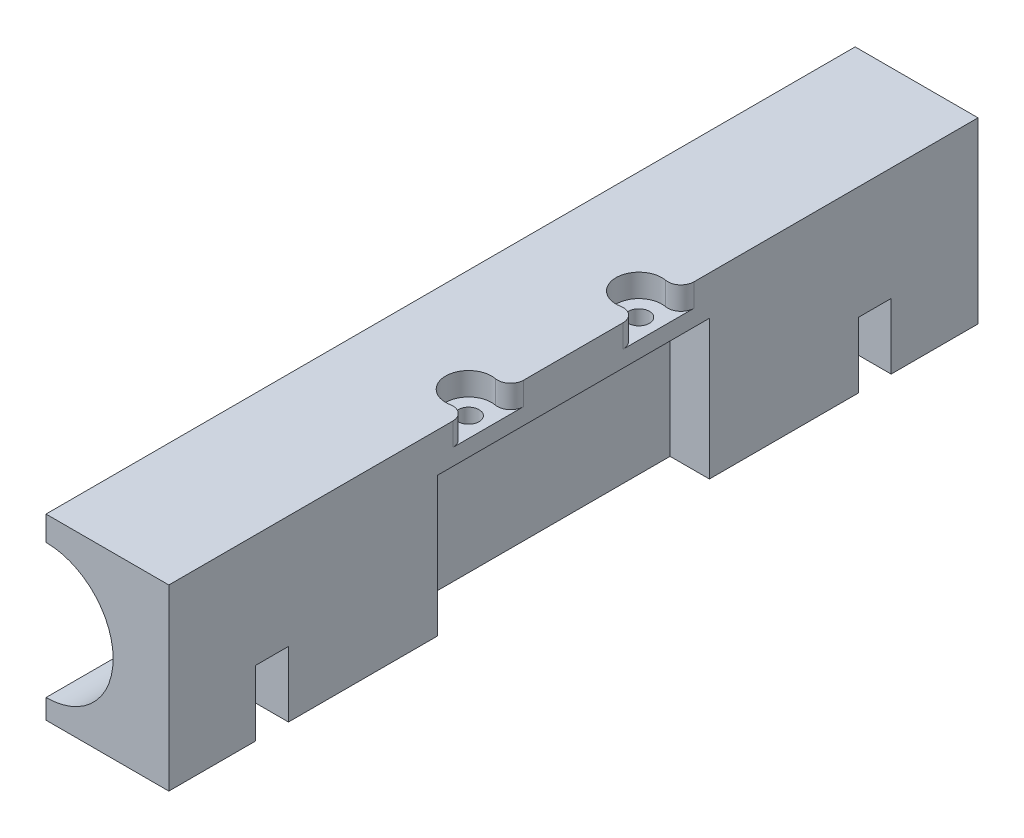
ISO-10303-21;
HEADER;
FILE_DESCRIPTION(('STEP AP214'),'2;1');
FILE_NAME('part.step','',(''),(''),'','','');
FILE_SCHEMA(('AUTOMOTIVE_DESIGN { 1 0 10303 214 1 1 1 1 }'));
ENDSEC;
DATA;
#1=APPLICATION_CONTEXT('core data for automotive mechanical design processes');
#2=APPLICATION_PROTOCOL_DEFINITION('international standard','automotive_design',2000,#1);
#3=PRODUCT_CONTEXT('',#1,'mechanical');
#4=PRODUCT('Part','Part','',(#3));
#5=PRODUCT_RELATED_PRODUCT_CATEGORY('part','',(#4));
#6=PRODUCT_DEFINITION_FORMATION('','',#4);
#7=PRODUCT_DEFINITION_CONTEXT('part definition',#1,'design');
#8=PRODUCT_DEFINITION('design','',#6,#7);
#9=PRODUCT_DEFINITION_SHAPE('','',#8);
#10=(LENGTH_UNIT() NAMED_UNIT(*) SI_UNIT(.MILLI.,.METRE.));
#11=(NAMED_UNIT(*) PLANE_ANGLE_UNIT() SI_UNIT($,.RADIAN.));
#12=(NAMED_UNIT(*) SI_UNIT($,.STERADIAN.) SOLID_ANGLE_UNIT());
#13=UNCERTAINTY_MEASURE_WITH_UNIT(LENGTH_MEASURE(1.E-05),#10,'distance_accuracy_value','');
#14=(GEOMETRIC_REPRESENTATION_CONTEXT(3) GLOBAL_UNCERTAINTY_ASSIGNED_CONTEXT((#13)) GLOBAL_UNIT_ASSIGNED_CONTEXT((#10,
#11,#12)) REPRESENTATION_CONTEXT('',''));
#15=CARTESIAN_POINT('',(0.,0.,0.));
#16=DIRECTION('',(0.,0.,1.));
#17=DIRECTION('',(1.,0.,0.));
#18=AXIS2_PLACEMENT_3D('',#15,#16,#17);
#19=CARTESIAN_POINT('',(-15.75,0.,47.75));
#20=DIRECTION('',(1.,0.,0.));
#21=DIRECTION('',(0.,0.,-1.));
#22=AXIS2_PLACEMENT_3D('',#19,#20,#21);
#23=PLANE('',#22);
#24=DIRECTION('',(0.,0.,-1.));
#25=VECTOR('',#24,1.);
#26=CARTESIAN_POINT('',(-15.75,-18.25,47.75));
#27=LINE('',#26,#25);
#28=CARTESIAN_POINT('',(-15.75,-18.25,43.49));
#29=VERTEX_POINT('',#28);
#30=CARTESIAN_POINT('',(-15.75,-18.25,-43.49));
#31=VERTEX_POINT('',#30);
#32=EDGE_CURVE('E254',#29,#31,#27,.T.);
#33=ORIENTED_EDGE('',*,*,#32,.T.);
#34=DIRECTION('',(0.,-1.,0.));
#35=VECTOR('',#34,1.);
#36=CARTESIAN_POINT('',(-15.75,-21.25,-43.49));
#37=LINE('',#36,#35);
#38=CARTESIAN_POINT('',(-15.75,-21.25,-43.49));
#39=VERTEX_POINT('',#38);
#40=EDGE_CURVE('E238',#31,#39,#37,.T.);
#41=ORIENTED_EDGE('',*,*,#40,.T.);
#42=DIRECTION('',(0.,0.,-1.));
#43=VECTOR('',#42,1.);
#44=CARTESIAN_POINT('',(-15.75,-21.25,47.75));
#45=LINE('',#44,#43);
#46=CARTESIAN_POINT('',(-15.75,-21.25,43.49));
#47=VERTEX_POINT('',#46);
#48=EDGE_CURVE('E252',#47,#39,#45,.T.);
#49=ORIENTED_EDGE('',*,*,#48,.F.);
#50=DIRECTION('',(0.,1.,0.));
#51=VECTOR('',#50,1.);
#52=CARTESIAN_POINT('',(-15.75,-21.25,43.49));
#53=LINE('',#52,#51);
#54=EDGE_CURVE('E74',#47,#29,#53,.T.);
#55=ORIENTED_EDGE('',*,*,#54,.T.);
#56=EDGE_LOOP('',(#33,#41,#49,#55));
#57=FACE_BOUND('',#56,.T.);
#58=ADVANCED_FACE('F50',(#57),#23,.F.);
#59=CARTESIAN_POINT('',(-15.75,-18.25,61.75));
#60=VERTEX_POINT('',#59);
#61=CARTESIAN_POINT('',(-15.7500000000001,-18.25,48.49));
#62=VERTEX_POINT('',#61);
#63=EDGE_CURVE('E276',#60,#62,#27,.T.);
#64=ORIENTED_EDGE('',*,*,#63,.T.);
#65=DIRECTION('',(0.,-1.,0.));
#66=VECTOR('',#65,1.);
#67=CARTESIAN_POINT('',(-15.7500000000001,-21.25,48.49));
#68=LINE('',#67,#66);
#69=CARTESIAN_POINT('',(-15.7500000000001,-21.25,48.49));
#70=VERTEX_POINT('',#69);
#71=EDGE_CURVE('E414',#62,#70,#68,.T.);
#72=ORIENTED_EDGE('',*,*,#71,.T.);
#73=CARTESIAN_POINT('',(-15.75,-21.25,61.75));
#74=VERTEX_POINT('',#73);
#75=EDGE_CURVE('E262',#74,#70,#45,.T.);
#76=ORIENTED_EDGE('',*,*,#75,.F.);
#77=DIRECTION('',(0.,-1.,0.));
#78=VECTOR('',#77,1.);
#79=CARTESIAN_POINT('',(-15.75,-18.25,61.75));
#80=LINE('',#79,#78);
#81=EDGE_CURVE('E475',#60,#74,#80,.T.);
#82=ORIENTED_EDGE('',*,*,#81,.F.);
#83=EDGE_LOOP('',(#64,#72,#76,#82));
#84=FACE_BOUND('',#83,.T.);
#85=ADVANCED_FACE('F559',(#84),#23,.F.);
#86=CARTESIAN_POINT('',(0.,-21.25,47.75));
#87=DIRECTION('',(0.,1.,0.));
#88=DIRECTION('',(0.,0.,1.));
#89=AXIS2_PLACEMENT_3D('',#86,#87,#88);
#90=PLANE('',#89);
#91=ORIENTED_EDGE('',*,*,#48,.T.);
#92=DIRECTION('',(1.,0.,0.));
#93=VECTOR('',#92,1.);
#94=CARTESIAN_POINT('',(-15.75,-21.25,-43.49));
#95=LINE('',#94,#93);
#96=CARTESIAN_POINT('',(3.00000000000002,-21.25,-43.49));
#97=VERTEX_POINT('',#96);
#98=EDGE_CURVE('E235',#39,#97,#95,.T.);
#99=ORIENTED_EDGE('',*,*,#98,.T.);
#100=DIRECTION('',(0.,0.,-1.));
#101=VECTOR('',#100,1.);
#102=CARTESIAN_POINT('',(3.,-21.25,47.75));
#103=LINE('',#102,#101);
#104=CARTESIAN_POINT('',(2.99999999999999,-21.25,-20.75));
#105=VERTEX_POINT('',#104);
#106=EDGE_CURVE('E532',#105,#97,#103,.T.);
#107=ORIENTED_EDGE('',*,*,#106,.F.);
#108=DIRECTION('',(-1.,0.,0.));
#109=VECTOR('',#108,1.);
#110=CARTESIAN_POINT('',(2.99999999999999,-21.25,-20.75));
#111=LINE('',#110,#109);
#112=CARTESIAN_POINT('',(-3.00000000000001,-21.25,-20.75));
#113=VERTEX_POINT('',#112);
#114=EDGE_CURVE('E505',#105,#113,#111,.T.);
#115=ORIENTED_EDGE('',*,*,#114,.T.);
#116=DIRECTION('',(0.,0.,1.));
#117=VECTOR('',#116,1.);
#118=CARTESIAN_POINT('',(-3.00000000000001,-21.25,-20.75));
#119=LINE('',#118,#117);
#120=CARTESIAN_POINT('',(-3.00000000000001,-21.25,20.75));
#121=VERTEX_POINT('',#120);
#122=EDGE_CURVE('E509',#113,#121,#119,.T.);
#123=ORIENTED_EDGE('',*,*,#122,.T.);
#124=DIRECTION('',(1.,0.,0.));
#125=VECTOR('',#124,1.);
#126=CARTESIAN_POINT('',(-3.00000000000001,-21.25,20.75));
#127=LINE('',#126,#125);
#128=CARTESIAN_POINT('',(2.99999999999999,-21.25,20.75));
#129=VERTEX_POINT('',#128);
#130=EDGE_CURVE('E513',#121,#129,#127,.T.);
#131=ORIENTED_EDGE('',*,*,#130,.T.);
#132=CARTESIAN_POINT('',(2.99999999999998,-21.25,43.49));
#133=VERTEX_POINT('',#132);
#134=EDGE_CURVE('E533',#133,#129,#103,.T.);
#135=ORIENTED_EDGE('',*,*,#134,.F.);
#136=DIRECTION('',(1.,0.,0.));
#137=VECTOR('',#136,1.);
#138=CARTESIAN_POINT('',(-15.75,-21.25,43.49));
#139=LINE('',#138,#137);
#140=EDGE_CURVE('E260',#47,#133,#139,.T.);
#141=ORIENTED_EDGE('',*,*,#140,.F.);
#142=EDGE_LOOP('',(#91,#99,#107,#115,#123,#131,#135,#141));
#143=FACE_BOUND('',#142,.T.);
#144=ADVANCED_FACE('F258',(#143),#90,.F.);
#145=ORIENTED_EDGE('',*,*,#75,.T.);
#146=DIRECTION('',(1.,0.,0.));
#147=VECTOR('',#146,1.);
#148=CARTESIAN_POINT('',(-15.7500000000001,-21.25,48.49));
#149=LINE('',#148,#147);
#150=CARTESIAN_POINT('',(2.99999999999998,-21.25,48.49));
#151=VERTEX_POINT('',#150);
#152=EDGE_CURVE('E417',#70,#151,#149,.T.);
#153=ORIENTED_EDGE('',*,*,#152,.T.);
#154=CARTESIAN_POINT('',(3.,-21.25,61.75));
#155=VERTEX_POINT('',#154);
#156=EDGE_CURVE('E272',#155,#151,#103,.T.);
#157=ORIENTED_EDGE('',*,*,#156,.F.);
#158=DIRECTION('',(1.,0.,0.));
#159=VECTOR('',#158,1.);
#160=CARTESIAN_POINT('',(-15.75,-21.25,61.75));
#161=LINE('',#160,#159);
#162=EDGE_CURVE('E479',#74,#155,#161,.T.);
#163=ORIENTED_EDGE('',*,*,#162,.F.);
#164=EDGE_LOOP('',(#145,#153,#157,#163));
#165=FACE_BOUND('',#164,.T.);
#166=ADVANCED_FACE('F552',(#165),#90,.F.);
#167=CARTESIAN_POINT('',(0.,3.,-13.));
#168=DIRECTION('',(0.,-1.,0.));
#169=DIRECTION('',(0.,0.,-1.));
#170=AXIS2_PLACEMENT_3D('',#167,#168,#169);
#171=CYLINDRICAL_SURFACE('',#170,1.6);
#172=CARTESIAN_POINT('',(0.,0.,-13.));
#173=DIRECTION('',(0.,1.,0.));
#174=DIRECTION('',(0.,0.,1.));
#175=AXIS2_PLACEMENT_3D('',#172,#173,#174);
#176=CIRCLE('',#175,1.6);
#177=CARTESIAN_POINT('',(0.,0.,-11.4));
#178=VERTEX_POINT('',#177);
#179=EDGE_CURVE('E298',#178,#178,#176,.T.);
#180=ORIENTED_EDGE('',*,*,#179,.F.);
#181=EDGE_LOOP('',(#180));
#182=FACE_BOUND('',#181,.T.);
#183=CARTESIAN_POINT('',(0.,2.5,-13.));
#184=DIRECTION('',(0.,1.,0.));
#185=DIRECTION('',(0.,0.,1.));
#186=AXIS2_PLACEMENT_3D('',#183,#184,#185);
#187=CIRCLE('',#186,1.6);
#188=CARTESIAN_POINT('',(0.,2.5,-11.4));
#189=VERTEX_POINT('',#188);
#190=EDGE_CURVE('E331',#189,#189,#187,.T.);
#191=ORIENTED_EDGE('',*,*,#190,.T.);
#192=EDGE_LOOP('',(#191));
#193=FACE_BOUND('',#192,.T.);
#194=ADVANCED_FACE('F760',(#182,#193),#171,.F.);
#195=CARTESIAN_POINT('',(0.,3.,13.));
#196=DIRECTION('',(0.,-1.,0.));
#197=DIRECTION('',(0.,0.,-1.));
#198=AXIS2_PLACEMENT_3D('',#195,#196,#197);
#199=CYLINDRICAL_SURFACE('',#198,1.6);
#200=CARTESIAN_POINT('',(0.,0.,13.));
#201=DIRECTION('',(0.,1.,0.));
#202=DIRECTION('',(0.,0.,1.));
#203=AXIS2_PLACEMENT_3D('',#200,#201,#202);
#204=CIRCLE('',#203,1.6);
#205=CARTESIAN_POINT('',(0.,0.,14.6));
#206=VERTEX_POINT('',#205);
#207=EDGE_CURVE('E289',#206,#206,#204,.T.);
#208=ORIENTED_EDGE('',*,*,#207,.F.);
#209=EDGE_LOOP('',(#208));
#210=FACE_BOUND('',#209,.T.);
#211=CARTESIAN_POINT('',(0.,2.5,13.));
#212=DIRECTION('',(0.,1.,0.));
#213=DIRECTION('',(0.,0.,1.));
#214=AXIS2_PLACEMENT_3D('',#211,#212,#213);
#215=CIRCLE('',#214,1.6);
#216=CARTESIAN_POINT('',(0.,2.5,14.6));
#217=VERTEX_POINT('',#216);
#218=EDGE_CURVE('E325',#217,#217,#215,.T.);
#219=ORIENTED_EDGE('',*,*,#218,.T.);
#220=EDGE_LOOP('',(#219));
#221=FACE_BOUND('',#220,.T.);
#222=ADVANCED_FACE('F757',(#210,#221),#199,.F.);
#223=CARTESIAN_POINT('',(0.,0.,0.));
#224=DIRECTION('',(0.,-1.,0.));
#225=DIRECTION('',(0.,0.,-1.));
#226=AXIS2_PLACEMENT_3D('',#223,#224,#225);
#227=PLANE('',#226);
#228=ORIENTED_EDGE('',*,*,#179,.T.);
#229=EDGE_LOOP('',(#228));
#230=FACE_BOUND('',#229,.T.);
#231=DIRECTION('',(0.,0.,-1.));
#232=VECTOR('',#231,1.);
#233=CARTESIAN_POINT('',(2.99999999999999,0.,20.75));
#234=LINE('',#233,#232);
#235=CARTESIAN_POINT('',(2.99999999999999,0.,20.75));
#236=VERTEX_POINT('',#235);
#237=CARTESIAN_POINT('',(2.99999999999999,0.,-20.75));
#238=VERTEX_POINT('',#237);
#239=EDGE_CURVE('E302',#236,#238,#234,.T.);
#240=ORIENTED_EDGE('',*,*,#239,.F.);
#241=DIRECTION('',(1.,0.,0.));
#242=VECTOR('',#241,1.);
#243=CARTESIAN_POINT('',(-3.00000000000001,0.,20.75));
#244=LINE('',#243,#242);
#245=CARTESIAN_POINT('',(-3.00000000000001,0.,20.75));
#246=VERTEX_POINT('',#245);
#247=EDGE_CURVE('E313',#246,#236,#244,.T.);
#248=ORIENTED_EDGE('',*,*,#247,.F.);
#249=DIRECTION('',(0.,0.,1.));
#250=VECTOR('',#249,1.);
#251=CARTESIAN_POINT('',(-3.00000000000001,0.,20.75));
#252=LINE('',#251,#250);
#253=CARTESIAN_POINT('',(-3.00000000000001,0.,-20.75));
#254=VERTEX_POINT('',#253);
#255=EDGE_CURVE('E309',#254,#246,#252,.T.);
#256=ORIENTED_EDGE('',*,*,#255,.F.);
#257=DIRECTION('',(-1.,0.,0.));
#258=VECTOR('',#257,1.);
#259=CARTESIAN_POINT('',(-3.00000000000001,0.,-20.75));
#260=LINE('',#259,#258);
#261=EDGE_CURVE('E306',#238,#254,#260,.T.);
#262=ORIENTED_EDGE('',*,*,#261,.F.);
#263=EDGE_LOOP('',(#240,#248,#256,#262));
#264=FACE_BOUND('',#263,.T.);
#265=ORIENTED_EDGE('',*,*,#207,.T.);
#266=EDGE_LOOP('',(#265));
#267=FACE_BOUND('',#266,.T.);
#268=ADVANCED_FACE('F569',(#230,#264,#267),#227,.T.);
#269=CARTESIAN_POINT('',(2.99999999999999,3.,20.75));
#270=DIRECTION('',(-1.,0.,0.));
#271=DIRECTION('',(0.,0.,1.));
#272=AXIS2_PLACEMENT_3D('',#269,#270,#271);
#273=PLANE('',#272);
#274=ORIENTED_EDGE('',*,*,#106,.T.);
#275=DIRECTION('',(0.,-1.,0.));
#276=VECTOR('',#275,1.);
#277=CARTESIAN_POINT('',(3.00000000000002,-21.25,-43.49));
#278=LINE('',#277,#276);
#279=CARTESIAN_POINT('',(3.00000000000002,-11.25,-43.49));
#280=VERTEX_POINT('',#279);
#281=EDGE_CURVE('E241',#280,#97,#278,.T.);
#282=ORIENTED_EDGE('',*,*,#281,.F.);
#283=DIRECTION('',(0.,0.,1.));
#284=VECTOR('',#283,1.);
#285=CARTESIAN_POINT('',(3.00000000000002,-11.25,-43.49));
#286=LINE('',#285,#284);
#287=CARTESIAN_POINT('',(3.00000000000002,-11.25,-48.49));
#288=VERTEX_POINT('',#287);
#289=EDGE_CURVE('E256',#288,#280,#286,.T.);
#290=ORIENTED_EDGE('',*,*,#289,.F.);
#291=DIRECTION('',(0.,1.,0.));
#292=VECTOR('',#291,1.);
#293=CARTESIAN_POINT('',(3.00000000000002,-21.25,-48.49));
#294=LINE('',#293,#292);
#295=CARTESIAN_POINT('',(3.00000000000002,-21.25,-48.49));
#296=VERTEX_POINT('',#295);
#297=EDGE_CURVE('E578',#296,#288,#294,.T.);
#298=ORIENTED_EDGE('',*,*,#297,.F.);
#299=CARTESIAN_POINT('',(3.,-21.25,-61.75));
#300=VERTEX_POINT('',#299);
#301=EDGE_CURVE('E526',#296,#300,#103,.T.);
#302=ORIENTED_EDGE('',*,*,#301,.T.);
#303=DIRECTION('',(0.,-1.,0.));
#304=VECTOR('',#303,1.);
#305=CARTESIAN_POINT('',(2.99999999999998,6.,-61.75));
#306=LINE('',#305,#304);
#307=CARTESIAN_POINT('',(2.99999999999998,6.,-61.75));
#308=VERTEX_POINT('',#307);
#309=EDGE_CURVE('E459',#308,#300,#306,.T.);
#310=ORIENTED_EDGE('',*,*,#309,.F.);
#311=DIRECTION('',(0.,0.,-1.));
#312=VECTOR('',#311,1.);
#313=CARTESIAN_POINT('',(2.99999999999998,6.,-47.75));
#314=LINE('',#313,#312);
#315=CARTESIAN_POINT('',(2.99999999999999,6.,-18.408326913196));
#316=VERTEX_POINT('',#315);
#317=EDGE_CURVE('E519',#316,#308,#314,.T.);
#318=ORIENTED_EDGE('',*,*,#317,.F.);
#319=DIRECTION('',(0.,1.,0.));
#320=VECTOR('',#319,1.);
#321=CARTESIAN_POINT('',(3.00000000000001,3.,-18.408326913196));
#322=LINE('',#321,#320);
#323=CARTESIAN_POINT('',(3.00000000000001,2.5,-18.408326913196));
#324=VERTEX_POINT('',#323);
#325=EDGE_CURVE('E343',#316,#324,#322,.F.);
#326=ORIENTED_EDGE('',*,*,#325,.T.);
#327=DIRECTION('',(0.,0.,-1.));
#328=VECTOR('',#327,1.);
#329=CARTESIAN_POINT('',(2.99999999999999,2.5,20.75));
#330=LINE('',#329,#328);
#331=CARTESIAN_POINT('',(3.,2.5,-7.59167308680402));
#332=VERTEX_POINT('',#331);
#333=EDGE_CURVE('E335',#332,#324,#330,.T.);
#334=ORIENTED_EDGE('',*,*,#333,.F.);
#335=DIRECTION('',(0.,1.,0.));
#336=VECTOR('',#335,1.);
#337=CARTESIAN_POINT('',(3.,3.,-7.59167308680402));
#338=LINE('',#337,#336);
#339=CARTESIAN_POINT('',(2.99999999999999,6.,-7.59167308680403));
#340=VERTEX_POINT('',#339);
#341=EDGE_CURVE('E347',#332,#340,#338,.T.);
#342=ORIENTED_EDGE('',*,*,#341,.T.);
#343=CARTESIAN_POINT('',(2.99999999999999,6.,7.591673086804));
#344=VERTEX_POINT('',#343);
#345=EDGE_CURVE('E524',#344,#340,#314,.T.);
#346=ORIENTED_EDGE('',*,*,#345,.F.);
#347=DIRECTION('',(0.,1.,0.));
#348=VECTOR('',#347,1.);
#349=CARTESIAN_POINT('',(3.,3.,7.59167308680402));
#350=LINE('',#349,#348);
#351=CARTESIAN_POINT('',(3.,2.5,7.59167308680402));
#352=VERTEX_POINT('',#351);
#353=EDGE_CURVE('E339',#344,#352,#350,.F.);
#354=ORIENTED_EDGE('',*,*,#353,.T.);
#355=DIRECTION('',(0.,0.,-1.));
#356=VECTOR('',#355,1.);
#357=CARTESIAN_POINT('',(2.99999999999999,2.5,20.75));
#358=LINE('',#357,#356);
#359=CARTESIAN_POINT('',(2.99999999999999,2.5,18.408326913196));
#360=VERTEX_POINT('',#359);
#361=EDGE_CURVE('E329',#360,#352,#358,.T.);
#362=ORIENTED_EDGE('',*,*,#361,.F.);
#363=DIRECTION('',(0.,1.,0.));
#364=VECTOR('',#363,1.);
#365=CARTESIAN_POINT('',(2.99999999999999,3.,18.408326913196));
#366=LINE('',#365,#364);
#367=CARTESIAN_POINT('',(2.99999999999999,6.,18.408326913196));
#368=VERTEX_POINT('',#367);
#369=EDGE_CURVE('E324',#360,#368,#366,.T.);
#370=ORIENTED_EDGE('',*,*,#369,.T.);
#371=CARTESIAN_POINT('',(2.99999999999999,6.,61.75));
#372=VERTEX_POINT('',#371);
#373=EDGE_CURVE('E520',#372,#368,#314,.T.);
#374=ORIENTED_EDGE('',*,*,#373,.F.);
#375=DIRECTION('',(0.,1.,0.));
#376=VECTOR('',#375,1.);
#377=CARTESIAN_POINT('',(3.,-21.25,61.75));
#378=LINE('',#377,#376);
#379=EDGE_CURVE('E483',#155,#372,#378,.T.);
#380=ORIENTED_EDGE('',*,*,#379,.F.);
#381=ORIENTED_EDGE('',*,*,#156,.T.);
#382=DIRECTION('',(0.,-1.,0.));
#383=VECTOR('',#382,1.);
#384=CARTESIAN_POINT('',(2.99999999999998,-21.25,48.49));
#385=LINE('',#384,#383);
#386=CARTESIAN_POINT('',(2.99999999999998,-11.25,48.49));
#387=VERTEX_POINT('',#386);
#388=EDGE_CURVE('E423',#387,#151,#385,.T.);
#389=ORIENTED_EDGE('',*,*,#388,.F.);
#390=DIRECTION('',(0.,0.,1.));
#391=VECTOR('',#390,1.);
#392=CARTESIAN_POINT('',(2.99999999999998,-11.25,43.49));
#393=LINE('',#392,#391);
#394=CARTESIAN_POINT('',(2.99999999999998,-11.25,43.49));
#395=VERTEX_POINT('',#394);
#396=EDGE_CURVE('E426',#395,#387,#393,.T.);
#397=ORIENTED_EDGE('',*,*,#396,.F.);
#398=DIRECTION('',(0.,1.,0.));
#399=VECTOR('',#398,1.);
#400=CARTESIAN_POINT('',(2.99999999999998,-21.25,43.49));
#401=LINE('',#400,#399);
#402=EDGE_CURVE('E407',#133,#395,#401,.T.);
#403=ORIENTED_EDGE('',*,*,#402,.F.);
#404=ORIENTED_EDGE('',*,*,#134,.T.);
#405=DIRECTION('',(0.,1.,0.));
#406=VECTOR('',#405,1.);
#407=CARTESIAN_POINT('',(2.99999999999999,0.,20.75));
#408=LINE('',#407,#406);
#409=EDGE_CURVE('E280',#129,#236,#408,.T.);
#410=ORIENTED_EDGE('',*,*,#409,.T.);
#411=ORIENTED_EDGE('',*,*,#239,.T.);
#412=DIRECTION('',(0.,1.,0.));
#413=VECTOR('',#412,1.);
#414=CARTESIAN_POINT('',(2.99999999999999,0.,-20.75));
#415=LINE('',#414,#413);
#416=EDGE_CURVE('E523',#105,#238,#415,.T.);
#417=ORIENTED_EDGE('',*,*,#416,.F.);
#418=EDGE_LOOP('',(#274,#282,#290,#298,#302,#310,#318,#326,#334,#342,#346,#354,#362,#370,#374,
#380,#381,#389,#397,#403,#404,#410,#411,#417));
#419=FACE_BOUND('',#418,.T.);
#420=ADVANCED_FACE('F549',(#419),#273,.F.);
#421=CARTESIAN_POINT('',(-3.00000000000001,0.,-37.5893141190489));
#422=DIRECTION('',(-1.,0.,0.));
#423=DIRECTION('',(0.,-1.,0.));
#424=AXIS2_PLACEMENT_3D('',#421,#422,#423);
#425=PLANE('',#424);
#426=DIRECTION('',(0.,1.,0.));
#427=VECTOR('',#426,1.);
#428=CARTESIAN_POINT('',(-3.00000000000001,0.,-20.75));
#429=LINE('',#428,#427);
#430=EDGE_CURVE('E285',#113,#254,#429,.T.);
#431=ORIENTED_EDGE('',*,*,#430,.T.);
#432=ORIENTED_EDGE('',*,*,#255,.T.);
#433=DIRECTION('',(0.,-1.,0.));
#434=VECTOR('',#433,1.);
#435=CARTESIAN_POINT('',(-3.00000000000001,0.,20.75));
#436=LINE('',#435,#434);
#437=EDGE_CURVE('E284',#246,#121,#436,.T.);
#438=ORIENTED_EDGE('',*,*,#437,.T.);
#439=ORIENTED_EDGE('',*,*,#122,.F.);
#440=EDGE_LOOP('',(#431,#432,#438,#439));
#441=FACE_BOUND('',#440,.T.);
#442=ADVANCED_FACE('F574',(#441),#425,.F.);
#443=CARTESIAN_POINT('',(-15.75,-8.,-37.5893141190489));
#444=DIRECTION('',(0.,0.,1.));
#445=DIRECTION('',(1.,0.,0.));
#446=AXIS2_PLACEMENT_3D('',#443,#444,#445);
#447=CYLINDRICAL_SURFACE('',#446,10.25);
#448=DIRECTION('',(0.,0.,1.));
#449=VECTOR('',#448,1.);
#450=CARTESIAN_POINT('',(-6.02888895238822,-11.25,-37.5893141190489));
#451=LINE('',#450,#449);
#452=CARTESIAN_POINT('',(-6.02888895238822,-11.25,-48.49));
#453=VERTEX_POINT('',#452);
#454=CARTESIAN_POINT('',(-6.02888895238822,-11.25,-43.49));
#455=VERTEX_POINT('',#454);
#456=EDGE_CURVE('E11',#453,#455,#451,.T.);
#457=ORIENTED_EDGE('',*,*,#456,.T.);
#458=CARTESIAN_POINT('',(-15.75,-8.,-43.49));
#459=DIRECTION('',(0.,0.,1.));
#460=DIRECTION('',(1.,0.,0.));
#461=AXIS2_PLACEMENT_3D('',#458,#459,#460);
#462=CIRCLE('',#461,10.25);
#463=EDGE_CURVE('E444',#455,#31,#462,.F.);
#464=ORIENTED_EDGE('',*,*,#463,.T.);
#465=ORIENTED_EDGE('',*,*,#32,.F.);
#466=CARTESIAN_POINT('',(-15.75,-8.,43.49));
#467=DIRECTION('',(0.,0.,-1.));
#468=DIRECTION('',(-1.,0.,0.));
#469=AXIS2_PLACEMENT_3D('',#466,#467,#468);
#470=CIRCLE('',#469,10.25);
#471=CARTESIAN_POINT('',(-6.02888895238822,-11.25,43.49));
#472=VERTEX_POINT('',#471);
#473=EDGE_CURVE('E396',#29,#472,#470,.F.);
#474=ORIENTED_EDGE('',*,*,#473,.T.);
#475=DIRECTION('',(0.,0.,1.));
#476=VECTOR('',#475,1.);
#477=CARTESIAN_POINT('',(-6.02888895238822,-11.25,-37.5893141190489));
#478=LINE('',#477,#476);
#479=CARTESIAN_POINT('',(-6.02888895238822,-11.25,48.49));
#480=VERTEX_POINT('',#479);
#481=EDGE_CURVE('E59',#472,#480,#478,.T.);
#482=ORIENTED_EDGE('',*,*,#481,.T.);
#483=CARTESIAN_POINT('',(-15.75,-8.,48.49));
#484=DIRECTION('',(0.,0.,1.));
#485=DIRECTION('',(1.,0.,0.));
#486=AXIS2_PLACEMENT_3D('',#483,#484,#485);
#487=CIRCLE('',#486,10.25);
#488=EDGE_CURVE('E395',#480,#62,#487,.F.);
#489=ORIENTED_EDGE('',*,*,#488,.T.);
#490=ORIENTED_EDGE('',*,*,#63,.F.);
#491=CARTESIAN_POINT('',(-15.75,-8.,61.75));
#492=DIRECTION('',(0.,0.,-1.));
#493=DIRECTION('',(1.,0.,0.));
#494=AXIS2_PLACEMENT_3D('',#491,#492,#493);
#495=CIRCLE('',#494,10.25);
#496=CARTESIAN_POINT('',(-15.75,2.25,61.75));
#497=VERTEX_POINT('',#496);
#498=EDGE_CURVE('E471',#497,#60,#495,.T.);
#499=ORIENTED_EDGE('',*,*,#498,.F.);
#500=DIRECTION('',(0.,0.,1.));
#501=VECTOR('',#500,1.);
#502=CARTESIAN_POINT('',(-15.75,2.25,-37.5893141190489));
#503=LINE('',#502,#501);
#504=CARTESIAN_POINT('',(-15.75,2.25,-61.75));
#505=VERTEX_POINT('',#504);
#506=EDGE_CURVE('E290',#505,#497,#503,.T.);
#507=ORIENTED_EDGE('',*,*,#506,.F.);
#508=CARTESIAN_POINT('',(-15.75,-8.,-61.75));
#509=DIRECTION('',(0.,0.,1.));
#510=DIRECTION('',(-1.,0.,0.));
#511=AXIS2_PLACEMENT_3D('',#508,#509,#510);
#512=CIRCLE('',#511,10.25);
#513=CARTESIAN_POINT('',(-15.75,-18.25,-61.75));
#514=VERTEX_POINT('',#513);
#515=EDGE_CURVE('E447',#514,#505,#512,.T.);
#516=ORIENTED_EDGE('',*,*,#515,.F.);
#517=CARTESIAN_POINT('',(-15.75,-18.25,-48.49));
#518=VERTEX_POINT('',#517);
#519=EDGE_CURVE('E270',#518,#514,#27,.T.);
#520=ORIENTED_EDGE('',*,*,#519,.F.);
#521=CARTESIAN_POINT('',(-15.75,-8.,-48.49));
#522=DIRECTION('',(0.,0.,-1.));
#523=DIRECTION('',(-1.,0.,0.));
#524=AXIS2_PLACEMENT_3D('',#521,#522,#523);
#525=CIRCLE('',#524,10.25);
#526=EDGE_CURVE('E440',#518,#453,#525,.F.);
#527=ORIENTED_EDGE('',*,*,#526,.T.);
#528=EDGE_LOOP('',(#457,#464,#465,#474,#482,#489,#490,#499,#507,#516,#520,#527));
#529=FACE_BOUND('',#528,.T.);
#530=ADVANCED_FACE('F394',(#529),#447,.F.);
#531=CARTESIAN_POINT('',(-15.75,0.,-37.5893141190489));
#532=DIRECTION('',(1.,0.,0.));
#533=DIRECTION('',(0.,1.,0.));
#534=AXIS2_PLACEMENT_3D('',#531,#532,#533);
#535=PLANE('',#534);
#536=ORIENTED_EDGE('',*,*,#506,.T.);
#537=DIRECTION('',(0.,-1.,0.));
#538=VECTOR('',#537,1.);
#539=CARTESIAN_POINT('',(-15.75,6.,61.75));
#540=LINE('',#539,#538);
#541=CARTESIAN_POINT('',(-15.75,6.,61.75));
#542=VERTEX_POINT('',#541);
#543=EDGE_CURVE('E491',#542,#497,#540,.T.);
#544=ORIENTED_EDGE('',*,*,#543,.F.);
#545=DIRECTION('',(0.,0.,1.));
#546=VECTOR('',#545,1.);
#547=CARTESIAN_POINT('',(-15.75,6.,-47.75));
#548=LINE('',#547,#546);
#549=CARTESIAN_POINT('',(-15.75,6.,-61.75));
#550=VERTEX_POINT('',#549);
#551=EDGE_CURVE('E516',#550,#542,#548,.T.);
#552=ORIENTED_EDGE('',*,*,#551,.F.);
#553=DIRECTION('',(0.,1.,0.));
#554=VECTOR('',#553,1.);
#555=CARTESIAN_POINT('',(-15.75,2.25,-61.75));
#556=LINE('',#555,#554);
#557=EDGE_CURVE('E451',#505,#550,#556,.T.);
#558=ORIENTED_EDGE('',*,*,#557,.F.);
#559=EDGE_LOOP('',(#536,#544,#552,#558));
#560=FACE_BOUND('',#559,.T.);
#561=ADVANCED_FACE('F700',(#560),#535,.F.);
#562=CARTESIAN_POINT('',(0.,0.,20.75));
#563=DIRECTION('',(0.,0.,1.));
#564=DIRECTION('',(1.,0.,0.));
#565=AXIS2_PLACEMENT_3D('',#562,#563,#564);
#566=PLANE('',#565);
#567=ORIENTED_EDGE('',*,*,#437,.F.);
#568=ORIENTED_EDGE('',*,*,#247,.T.);
#569=ORIENTED_EDGE('',*,*,#409,.F.);
#570=ORIENTED_EDGE('',*,*,#130,.F.);
#571=EDGE_LOOP('',(#567,#568,#569,#570));
#572=FACE_BOUND('',#571,.T.);
#573=ADVANCED_FACE('F565',(#572),#566,.F.);
#574=CARTESIAN_POINT('',(-15.75,-21.25,-48.49));
#575=VERTEX_POINT('',#574);
#576=CARTESIAN_POINT('',(-15.75,-21.25,-61.75));
#577=VERTEX_POINT('',#576);
#578=EDGE_CURVE('E263',#575,#577,#45,.T.);
#579=ORIENTED_EDGE('',*,*,#578,.F.);
#580=DIRECTION('',(0.,1.,0.));
#581=VECTOR('',#580,1.);
#582=CARTESIAN_POINT('',(-15.75,-21.25,-48.49));
#583=LINE('',#582,#581);
#584=EDGE_CURVE('E66',#575,#518,#583,.T.);
#585=ORIENTED_EDGE('',*,*,#584,.T.);
#586=ORIENTED_EDGE('',*,*,#519,.T.);
#587=DIRECTION('',(0.,1.,0.));
#588=VECTOR('',#587,1.);
#589=CARTESIAN_POINT('',(-15.75,-21.25,-61.75));
#590=LINE('',#589,#588);
#591=EDGE_CURVE('E467',#577,#514,#590,.T.);
#592=ORIENTED_EDGE('',*,*,#591,.F.);
#593=EDGE_LOOP('',(#579,#585,#586,#592));
#594=FACE_BOUND('',#593,.T.);
#595=ADVANCED_FACE('F605',(#594),#23,.F.);
#596=ORIENTED_EDGE('',*,*,#301,.F.);
#597=DIRECTION('',(1.,0.,0.));
#598=VECTOR('',#597,1.);
#599=CARTESIAN_POINT('',(-15.75,-21.25,-48.49));
#600=LINE('',#599,#598);
#601=EDGE_CURVE('E247',#575,#296,#600,.T.);
#602=ORIENTED_EDGE('',*,*,#601,.F.);
#603=ORIENTED_EDGE('',*,*,#578,.T.);
#604=DIRECTION('',(-1.,0.,0.));
#605=VECTOR('',#604,1.);
#606=CARTESIAN_POINT('',(3.,-21.25,-61.75));
#607=LINE('',#606,#605);
#608=EDGE_CURVE('E463',#300,#577,#607,.T.);
#609=ORIENTED_EDGE('',*,*,#608,.F.);
#610=EDGE_LOOP('',(#596,#602,#603,#609));
#611=FACE_BOUND('',#610,.T.);
#612=ADVANCED_FACE('F599',(#611),#90,.F.);
#613=CARTESIAN_POINT('',(0.,0.,-20.75));
#614=DIRECTION('',(0.,0.,-1.));
#615=DIRECTION('',(1.,0.,0.));
#616=AXIS2_PLACEMENT_3D('',#613,#614,#615);
#617=PLANE('',#616);
#618=ORIENTED_EDGE('',*,*,#416,.T.);
#619=ORIENTED_EDGE('',*,*,#261,.T.);
#620=ORIENTED_EDGE('',*,*,#430,.F.);
#621=ORIENTED_EDGE('',*,*,#114,.F.);
#622=EDGE_LOOP('',(#618,#619,#620,#621));
#623=FACE_BOUND('',#622,.T.);
#624=ADVANCED_FACE('F572',(#623),#617,.F.);
#625=CARTESIAN_POINT('',(0.,6.,0.));
#626=DIRECTION('',(0.,1.,0.));
#627=DIRECTION('',(0.,0.,1.));
#628=AXIS2_PLACEMENT_3D('',#625,#626,#627);
#629=PLANE('',#628);
#630=ORIENTED_EDGE('',*,*,#345,.T.);
#631=CARTESIAN_POINT('',(1.,6.,-7.59167308680402));
#632=DIRECTION('',(0.,1.,0.));
#633=DIRECTION('',(0.,0.,1.));
#634=AXIS2_PLACEMENT_3D('',#631,#632,#633);
#635=CIRCLE('',#634,2.);
#636=CARTESIAN_POINT('',(0.636363636363638,6.,-9.55833741887528));
#637=VERTEX_POINT('',#636);
#638=EDGE_CURVE('E360',#340,#637,#635,.T.);
#639=ORIENTED_EDGE('',*,*,#638,.T.);
#640=CARTESIAN_POINT('',(0.,6.,-13.));
#641=DIRECTION('',(0.,1.,0.));
#642=DIRECTION('',(0.,0.,1.));
#643=AXIS2_PLACEMENT_3D('',#640,#641,#642);
#644=CIRCLE('',#643,3.5);
#645=CARTESIAN_POINT('',(0.63636363636364,6.,-16.4416625811247));
#646=VERTEX_POINT('',#645);
#647=EDGE_CURVE('E320',#646,#637,#644,.T.);
#648=ORIENTED_EDGE('',*,*,#647,.F.);
#649=CARTESIAN_POINT('',(1.00000000000001,6.,-18.408326913196));
#650=DIRECTION('',(0.,1.,0.));
#651=DIRECTION('',(0.,0.,1.));
#652=AXIS2_PLACEMENT_3D('',#649,#650,#651);
#653=CIRCLE('',#652,2.);
#654=EDGE_CURVE('E357',#646,#316,#653,.T.);
#655=ORIENTED_EDGE('',*,*,#654,.T.);
#656=ORIENTED_EDGE('',*,*,#317,.T.);
#657=DIRECTION('',(1.,0.,0.));
#658=VECTOR('',#657,1.);
#659=CARTESIAN_POINT('',(-15.75,6.,-61.75));
#660=LINE('',#659,#658);
#661=EDGE_CURVE('E455',#550,#308,#660,.T.);
#662=ORIENTED_EDGE('',*,*,#661,.F.);
#663=ORIENTED_EDGE('',*,*,#551,.T.);
#664=DIRECTION('',(-1.,0.,0.));
#665=VECTOR('',#664,1.);
#666=CARTESIAN_POINT('',(2.99999999999999,6.,61.75));
#667=LINE('',#666,#665);
#668=EDGE_CURVE('E487',#372,#542,#667,.T.);
#669=ORIENTED_EDGE('',*,*,#668,.F.);
#670=ORIENTED_EDGE('',*,*,#373,.T.);
#671=CARTESIAN_POINT('',(0.999999999999994,6.,18.408326913196));
#672=DIRECTION('',(0.,1.,0.));
#673=DIRECTION('',(0.,0.,1.));
#674=AXIS2_PLACEMENT_3D('',#671,#672,#673);
#675=CIRCLE('',#674,2.);
#676=CARTESIAN_POINT('',(0.636363636363632,6.,16.4416625811247));
#677=VERTEX_POINT('',#676);
#678=EDGE_CURVE('E351',#368,#677,#675,.T.);
#679=ORIENTED_EDGE('',*,*,#678,.T.);
#680=CARTESIAN_POINT('',(0.,6.,13.));
#681=DIRECTION('',(0.,1.,0.));
#682=DIRECTION('',(0.,0.,1.));
#683=AXIS2_PLACEMENT_3D('',#680,#681,#682);
#684=CIRCLE('',#683,3.5);
#685=CARTESIAN_POINT('',(0.636363636363635,6.,9.55833741887528));
#686=VERTEX_POINT('',#685);
#687=EDGE_CURVE('E316',#686,#677,#684,.T.);
#688=ORIENTED_EDGE('',*,*,#687,.F.);
#689=CARTESIAN_POINT('',(0.999999999999997,6.,7.59167308680401));
#690=DIRECTION('',(0.,1.,0.));
#691=DIRECTION('',(0.,0.,1.));
#692=AXIS2_PLACEMENT_3D('',#689,#690,#691);
#693=CIRCLE('',#692,2.);
#694=EDGE_CURVE('E354',#686,#344,#693,.T.);
#695=ORIENTED_EDGE('',*,*,#694,.T.);
#696=EDGE_LOOP('',(#630,#639,#648,#655,#656,#662,#663,#669,#670,#679,#688,#695));
#697=FACE_BOUND('',#696,.T.);
#698=ADVANCED_FACE('F694',(#697),#629,.T.);
#699=CARTESIAN_POINT('',(0.,2.5,13.));
#700=DIRECTION('',(0.,1.,0.));
#701=DIRECTION('',(0.,0.,1.));
#702=AXIS2_PLACEMENT_3D('',#699,#700,#701);
#703=PLANE('',#702);
#704=ORIENTED_EDGE('',*,*,#218,.F.);
#705=EDGE_LOOP('',(#704));
#706=FACE_BOUND('',#705,.T.);
#707=ORIENTED_EDGE('',*,*,#361,.T.);
#708=CARTESIAN_POINT('',(0.999999999999997,2.5,7.59167308680401));
#709=DIRECTION('',(0.,1.,0.));
#710=DIRECTION('',(0.,0.,1.));
#711=AXIS2_PLACEMENT_3D('',#708,#709,#710);
#712=CIRCLE('',#711,2.);
#713=CARTESIAN_POINT('',(0.636363636363635,2.5,9.55833741887528));
#714=VERTEX_POINT('',#713);
#715=EDGE_CURVE('E381',#352,#714,#712,.F.);
#716=ORIENTED_EDGE('',*,*,#715,.T.);
#717=CARTESIAN_POINT('',(0.,2.5,13.));
#718=DIRECTION('',(0.,1.,0.));
#719=DIRECTION('',(0.,0.,1.));
#720=AXIS2_PLACEMENT_3D('',#717,#718,#719);
#721=CIRCLE('',#720,3.5);
#722=CARTESIAN_POINT('',(0.636363636363632,2.5,16.4416625811247));
#723=VERTEX_POINT('',#722);
#724=EDGE_CURVE('E495',#714,#723,#721,.T.);
#725=ORIENTED_EDGE('',*,*,#724,.T.);
#726=CARTESIAN_POINT('',(0.999999999999994,2.5,18.408326913196));
#727=DIRECTION('',(0.,1.,0.));
#728=DIRECTION('',(0.,0.,1.));
#729=AXIS2_PLACEMENT_3D('',#726,#727,#728);
#730=CIRCLE('',#729,2.);
#731=EDGE_CURVE('E384',#723,#360,#730,.F.);
#732=ORIENTED_EDGE('',*,*,#731,.T.);
#733=EDGE_LOOP('',(#707,#716,#725,#732));
#734=FACE_BOUND('',#733,.T.);
#735=ADVANCED_FACE('F712',(#706,#734),#703,.T.);
#736=CARTESIAN_POINT('',(0.,2.5,13.));
#737=DIRECTION('',(0.,1.,0.));
#738=DIRECTION('',(0.,0.,1.));
#739=AXIS2_PLACEMENT_3D('',#736,#737,#738);
#740=CYLINDRICAL_SURFACE('',#739,3.5);
#741=ORIENTED_EDGE('',*,*,#724,.F.);
#742=DIRECTION('',(0.,1.,0.));
#743=VECTOR('',#742,1.);
#744=CARTESIAN_POINT('',(0.636363636363635,2.5,9.55833741887528));
#745=LINE('',#744,#743);
#746=EDGE_CURVE('E372',#714,#686,#745,.T.);
#747=ORIENTED_EDGE('',*,*,#746,.T.);
#748=ORIENTED_EDGE('',*,*,#687,.T.);
#749=DIRECTION('',(0.,1.,0.));
#750=VECTOR('',#749,1.);
#751=CARTESIAN_POINT('',(0.636363636363632,2.5,16.4416625811247));
#752=LINE('',#751,#750);
#753=EDGE_CURVE('E369',#677,#723,#752,.F.);
#754=ORIENTED_EDGE('',*,*,#753,.T.);
#755=EDGE_LOOP('',(#741,#747,#748,#754));
#756=FACE_BOUND('',#755,.T.);
#757=ADVANCED_FACE('F709',(#756),#740,.F.);
#758=CARTESIAN_POINT('',(0.,2.5,-13.));
#759=DIRECTION('',(0.,1.,0.));
#760=DIRECTION('',(0.,0.,1.));
#761=AXIS2_PLACEMENT_3D('',#758,#759,#760);
#762=PLANE('',#761);
#763=ORIENTED_EDGE('',*,*,#190,.F.);
#764=EDGE_LOOP('',(#763));
#765=FACE_BOUND('',#764,.T.);
#766=ORIENTED_EDGE('',*,*,#333,.T.);
#767=CARTESIAN_POINT('',(1.00000000000001,2.5,-18.408326913196));
#768=DIRECTION('',(0.,1.,0.));
#769=DIRECTION('',(0.,0.,1.));
#770=AXIS2_PLACEMENT_3D('',#767,#768,#769);
#771=CIRCLE('',#770,2.);
#772=CARTESIAN_POINT('',(0.63636363636364,2.5,-16.4416625811247));
#773=VERTEX_POINT('',#772);
#774=EDGE_CURVE('E378',#324,#773,#771,.F.);
#775=ORIENTED_EDGE('',*,*,#774,.T.);
#776=CARTESIAN_POINT('',(0.,2.5,-13.));
#777=DIRECTION('',(0.,1.,0.));
#778=DIRECTION('',(0.,0.,1.));
#779=AXIS2_PLACEMENT_3D('',#776,#777,#778);
#780=CIRCLE('',#779,3.5);
#781=CARTESIAN_POINT('',(0.636363636363638,2.5,-9.55833741887528));
#782=VERTEX_POINT('',#781);
#783=EDGE_CURVE('E330',#773,#782,#780,.T.);
#784=ORIENTED_EDGE('',*,*,#783,.T.);
#785=CARTESIAN_POINT('',(1.,2.5,-7.59167308680402));
#786=DIRECTION('',(0.,1.,0.));
#787=DIRECTION('',(0.,0.,1.));
#788=AXIS2_PLACEMENT_3D('',#785,#786,#787);
#789=CIRCLE('',#788,2.);
#790=EDGE_CURVE('E375',#782,#332,#789,.F.);
#791=ORIENTED_EDGE('',*,*,#790,.T.);
#792=EDGE_LOOP('',(#766,#775,#784,#791));
#793=FACE_BOUND('',#792,.T.);
#794=ADVANCED_FACE('F729',(#765,#793),#762,.T.);
#795=CARTESIAN_POINT('',(0.,2.5,-13.));
#796=DIRECTION('',(0.,1.,0.));
#797=DIRECTION('',(0.,0.,1.));
#798=AXIS2_PLACEMENT_3D('',#795,#796,#797);
#799=CYLINDRICAL_SURFACE('',#798,3.5);
#800=ORIENTED_EDGE('',*,*,#647,.T.);
#801=DIRECTION('',(0.,1.,0.));
#802=VECTOR('',#801,1.);
#803=CARTESIAN_POINT('',(0.636363636363638,2.5,-9.55833741887528));
#804=LINE('',#803,#802);
#805=EDGE_CURVE('E366',#637,#782,#804,.F.);
#806=ORIENTED_EDGE('',*,*,#805,.T.);
#807=ORIENTED_EDGE('',*,*,#783,.F.);
#808=DIRECTION('',(0.,1.,0.));
#809=VECTOR('',#808,1.);
#810=CARTESIAN_POINT('',(0.63636363636364,2.5,-16.4416625811247));
#811=LINE('',#810,#809);
#812=EDGE_CURVE('E363',#773,#646,#811,.T.);
#813=ORIENTED_EDGE('',*,*,#812,.T.);
#814=EDGE_LOOP('',(#800,#806,#807,#813));
#815=FACE_BOUND('',#814,.T.);
#816=ADVANCED_FACE('F723',(#815),#799,.F.);
#817=CARTESIAN_POINT('',(1.,2.5,-7.59167308680402));
#818=DIRECTION('',(0.,1.,0.));
#819=DIRECTION('',(0.,0.,1.));
#820=AXIS2_PLACEMENT_3D('',#817,#818,#819);
#821=CYLINDRICAL_SURFACE('',#820,2.);
#822=ORIENTED_EDGE('',*,*,#790,.F.);
#823=ORIENTED_EDGE('',*,*,#805,.F.);
#824=ORIENTED_EDGE('',*,*,#638,.F.);
#825=ORIENTED_EDGE('',*,*,#341,.F.);
#826=EDGE_LOOP('',(#822,#823,#824,#825));
#827=FACE_BOUND('',#826,.T.);
#828=ADVANCED_FACE('F727',(#827),#821,.T.);
#829=CARTESIAN_POINT('',(1.00000000000001,2.5,-18.408326913196));
#830=DIRECTION('',(0.,1.,0.));
#831=DIRECTION('',(0.,0.,1.));
#832=AXIS2_PLACEMENT_3D('',#829,#830,#831);
#833=CYLINDRICAL_SURFACE('',#832,2.);
#834=ORIENTED_EDGE('',*,*,#654,.F.);
#835=ORIENTED_EDGE('',*,*,#812,.F.);
#836=ORIENTED_EDGE('',*,*,#774,.F.);
#837=ORIENTED_EDGE('',*,*,#325,.F.);
#838=EDGE_LOOP('',(#834,#835,#836,#837));
#839=FACE_BOUND('',#838,.T.);
#840=ADVANCED_FACE('F732',(#839),#833,.T.);
#841=CARTESIAN_POINT('',(0.999999999999997,2.5,7.59167308680401));
#842=DIRECTION('',(0.,1.,0.));
#843=DIRECTION('',(0.,0.,1.));
#844=AXIS2_PLACEMENT_3D('',#841,#842,#843);
#845=CYLINDRICAL_SURFACE('',#844,2.);
#846=ORIENTED_EDGE('',*,*,#694,.F.);
#847=ORIENTED_EDGE('',*,*,#746,.F.);
#848=ORIENTED_EDGE('',*,*,#715,.F.);
#849=ORIENTED_EDGE('',*,*,#353,.F.);
#850=EDGE_LOOP('',(#846,#847,#848,#849));
#851=FACE_BOUND('',#850,.T.);
#852=ADVANCED_FACE('F717',(#851),#845,.T.);
#853=CARTESIAN_POINT('',(0.999999999999994,2.5,18.408326913196));
#854=DIRECTION('',(0.,1.,0.));
#855=DIRECTION('',(0.,0.,1.));
#856=AXIS2_PLACEMENT_3D('',#853,#854,#855);
#857=CYLINDRICAL_SURFACE('',#856,2.);
#858=ORIENTED_EDGE('',*,*,#731,.F.);
#859=ORIENTED_EDGE('',*,*,#753,.F.);
#860=ORIENTED_EDGE('',*,*,#678,.F.);
#861=ORIENTED_EDGE('',*,*,#369,.F.);
#862=EDGE_LOOP('',(#858,#859,#860,#861));
#863=FACE_BOUND('',#862,.T.);
#864=ADVANCED_FACE('F52',(#863),#857,.T.);
#865=CARTESIAN_POINT('',(-15.75,-8.,61.75));
#866=DIRECTION('',(0.,0.,1.));
#867=DIRECTION('',(1.,0.,0.));
#868=AXIS2_PLACEMENT_3D('',#865,#866,#867);
#869=PLANE('',#868);
#870=ORIENTED_EDGE('',*,*,#498,.T.);
#871=ORIENTED_EDGE('',*,*,#81,.T.);
#872=ORIENTED_EDGE('',*,*,#162,.T.);
#873=ORIENTED_EDGE('',*,*,#379,.T.);
#874=ORIENTED_EDGE('',*,*,#668,.T.);
#875=ORIENTED_EDGE('',*,*,#543,.T.);
#876=EDGE_LOOP('',(#870,#871,#872,#873,#874,#875));
#877=FACE_BOUND('',#876,.T.);
#878=ADVANCED_FACE('F554',(#877),#869,.T.);
#879=CARTESIAN_POINT('',(-15.75,-8.,-61.75));
#880=DIRECTION('',(0.,0.,-1.));
#881=DIRECTION('',(-1.,0.,0.));
#882=AXIS2_PLACEMENT_3D('',#879,#880,#881);
#883=PLANE('',#882);
#884=ORIENTED_EDGE('',*,*,#515,.T.);
#885=ORIENTED_EDGE('',*,*,#557,.T.);
#886=ORIENTED_EDGE('',*,*,#661,.T.);
#887=ORIENTED_EDGE('',*,*,#309,.T.);
#888=ORIENTED_EDGE('',*,*,#608,.T.);
#889=ORIENTED_EDGE('',*,*,#591,.T.);
#890=EDGE_LOOP('',(#884,#885,#886,#887,#888,#889));
#891=FACE_BOUND('',#890,.T.);
#892=ADVANCED_FACE('F602',(#891),#883,.T.);
#893=CARTESIAN_POINT('',(-15.75,-11.25,43.49));
#894=DIRECTION('',(0.,1.,0.));
#895=DIRECTION('',(0.,0.,1.));
#896=AXIS2_PLACEMENT_3D('',#893,#894,#895);
#897=PLANE('',#896);
#898=DIRECTION('',(1.,0.,0.));
#899=VECTOR('',#898,1.);
#900=CARTESIAN_POINT('',(-15.75,-11.25,43.49));
#901=LINE('',#900,#899);
#902=EDGE_CURVE('E402',#472,#395,#901,.T.);
#903=ORIENTED_EDGE('',*,*,#902,.T.);
#904=ORIENTED_EDGE('',*,*,#396,.T.);
#905=DIRECTION('',(1.,0.,0.));
#906=VECTOR('',#905,1.);
#907=CARTESIAN_POINT('',(-15.7500000000001,-11.25,48.49));
#908=LINE('',#907,#906);
#909=EDGE_CURVE('E404',#480,#387,#908,.T.);
#910=ORIENTED_EDGE('',*,*,#909,.F.);
#911=ORIENTED_EDGE('',*,*,#481,.F.);
#912=EDGE_LOOP('',(#903,#904,#910,#911));
#913=FACE_BOUND('',#912,.T.);
#914=ADVANCED_FACE('F400',(#913),#897,.F.);
#915=CARTESIAN_POINT('',(-15.7500000000001,-21.25,48.49));
#916=DIRECTION('',(0.,0.,1.));
#917=DIRECTION('',(1.,0.,0.));
#918=AXIS2_PLACEMENT_3D('',#915,#916,#917);
#919=PLANE('',#918);
#920=ORIENTED_EDGE('',*,*,#909,.T.);
#921=ORIENTED_EDGE('',*,*,#388,.T.);
#922=ORIENTED_EDGE('',*,*,#152,.F.);
#923=ORIENTED_EDGE('',*,*,#71,.F.);
#924=ORIENTED_EDGE('',*,*,#488,.F.);
#925=EDGE_LOOP('',(#920,#921,#922,#923,#924));
#926=FACE_BOUND('',#925,.T.);
#927=ADVANCED_FACE('F561',(#926),#919,.F.);
#928=CARTESIAN_POINT('',(-15.75,-21.25,43.49));
#929=DIRECTION('',(0.,0.,-1.));
#930=DIRECTION('',(-1.,0.,0.));
#931=AXIS2_PLACEMENT_3D('',#928,#929,#930);
#932=PLANE('',#931);
#933=ORIENTED_EDGE('',*,*,#54,.F.);
#934=ORIENTED_EDGE('',*,*,#140,.T.);
#935=ORIENTED_EDGE('',*,*,#402,.T.);
#936=ORIENTED_EDGE('',*,*,#902,.F.);
#937=ORIENTED_EDGE('',*,*,#473,.F.);
#938=EDGE_LOOP('',(#933,#934,#935,#936,#937));
#939=FACE_BOUND('',#938,.T.);
#940=ADVANCED_FACE('F405',(#939),#932,.F.);
#941=CARTESIAN_POINT('',(-15.75,-11.25,-43.49));
#942=DIRECTION('',(0.,1.,0.));
#943=DIRECTION('',(0.,0.,1.));
#944=AXIS2_PLACEMENT_3D('',#941,#942,#943);
#945=PLANE('',#944);
#946=DIRECTION('',(1.,0.,0.));
#947=VECTOR('',#946,1.);
#948=CARTESIAN_POINT('',(-15.75,-11.25,-48.49));
#949=LINE('',#948,#947);
#950=EDGE_CURVE('E589',#453,#288,#949,.T.);
#951=ORIENTED_EDGE('',*,*,#950,.T.);
#952=ORIENTED_EDGE('',*,*,#289,.T.);
#953=DIRECTION('',(1.,0.,0.));
#954=VECTOR('',#953,1.);
#955=CARTESIAN_POINT('',(-15.75,-11.25,-43.49));
#956=LINE('',#955,#954);
#957=EDGE_CURVE('E437',#455,#280,#956,.T.);
#958=ORIENTED_EDGE('',*,*,#957,.F.);
#959=ORIENTED_EDGE('',*,*,#456,.F.);
#960=EDGE_LOOP('',(#951,#952,#958,#959));
#961=FACE_BOUND('',#960,.T.);
#962=ADVANCED_FACE('F931',(#961),#945,.F.);
#963=CARTESIAN_POINT('',(-15.75,-21.25,-43.49));
#964=DIRECTION('',(0.,0.,1.));
#965=DIRECTION('',(1.,0.,0.));
#966=AXIS2_PLACEMENT_3D('',#963,#964,#965);
#967=PLANE('',#966);
#968=ORIENTED_EDGE('',*,*,#957,.T.);
#969=ORIENTED_EDGE('',*,*,#281,.T.);
#970=ORIENTED_EDGE('',*,*,#98,.F.);
#971=ORIENTED_EDGE('',*,*,#40,.F.);
#972=ORIENTED_EDGE('',*,*,#463,.F.);
#973=EDGE_LOOP('',(#968,#969,#970,#971,#972));
#974=FACE_BOUND('',#973,.T.);
#975=ADVANCED_FACE('F237',(#974),#967,.F.);
#976=CARTESIAN_POINT('',(-15.75,-21.25,-48.49));
#977=DIRECTION('',(0.,0.,-1.));
#978=DIRECTION('',(-1.,0.,0.));
#979=AXIS2_PLACEMENT_3D('',#976,#977,#978);
#980=PLANE('',#979);
#981=ORIENTED_EDGE('',*,*,#584,.F.);
#982=ORIENTED_EDGE('',*,*,#601,.T.);
#983=ORIENTED_EDGE('',*,*,#297,.T.);
#984=ORIENTED_EDGE('',*,*,#950,.F.);
#985=ORIENTED_EDGE('',*,*,#526,.F.);
#986=EDGE_LOOP('',(#981,#982,#983,#984,#985));
#987=FACE_BOUND('',#986,.T.);
#988=ADVANCED_FACE('F594',(#987),#980,.F.);
#989=CLOSED_SHELL('',(#58,#85,#144,#166,#194,#222,#268,#420,#442,#530,#561,#573,#595,#612,#624,
#698,#735,#757,#794,#816,#828,#840,#852,#864,#878,#892,#914,#927,#940,#962,#975,#988));
#990=MANIFOLD_SOLID_BREP('B2',#989);
#991=ADVANCED_BREP_SHAPE_REPRESENTATION('',(#18,#990),#14);
#992=SHAPE_DEFINITION_REPRESENTATION(#9,#991);
ENDSEC;
END-ISO-10303-21;
